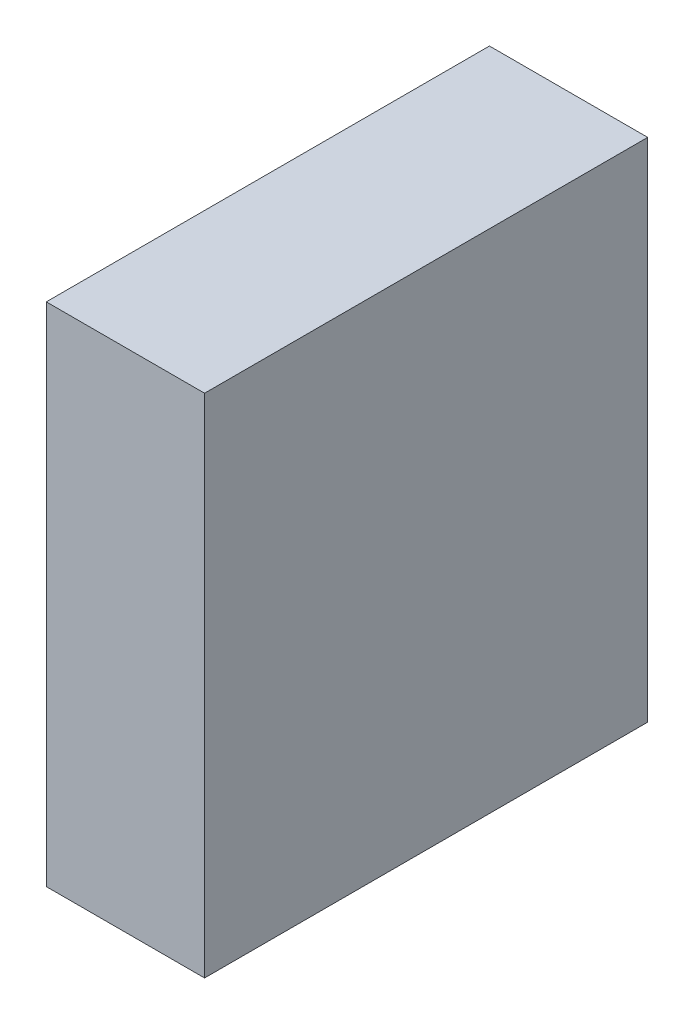
ISO-10303-21;
HEADER;
FILE_DESCRIPTION(('STEP AP214'),'2;1');
FILE_NAME('part.step','',(''),(''),'','','');
FILE_SCHEMA(('AUTOMOTIVE_DESIGN { 1 0 10303 214 1 1 1 1 }'));
ENDSEC;
DATA;
#1=APPLICATION_CONTEXT('core data for automotive mechanical design processes');
#2=APPLICATION_PROTOCOL_DEFINITION('international standard','automotive_design',2000,#1);
#3=PRODUCT_CONTEXT('',#1,'mechanical');
#4=PRODUCT('Part','Part','',(#3));
#5=PRODUCT_RELATED_PRODUCT_CATEGORY('part','',(#4));
#6=PRODUCT_DEFINITION_FORMATION('','',#4);
#7=PRODUCT_DEFINITION_CONTEXT('part definition',#1,'design');
#8=PRODUCT_DEFINITION('design','',#6,#7);
#9=PRODUCT_DEFINITION_SHAPE('','',#8);
#10=(LENGTH_UNIT() NAMED_UNIT(*) SI_UNIT(.MILLI.,.METRE.));
#11=(NAMED_UNIT(*) PLANE_ANGLE_UNIT() SI_UNIT($,.RADIAN.));
#12=(NAMED_UNIT(*) SI_UNIT($,.STERADIAN.) SOLID_ANGLE_UNIT());
#13=UNCERTAINTY_MEASURE_WITH_UNIT(LENGTH_MEASURE(1.E-05),#10,'distance_accuracy_value','');
#14=(GEOMETRIC_REPRESENTATION_CONTEXT(3) GLOBAL_UNCERTAINTY_ASSIGNED_CONTEXT((#13)) GLOBAL_UNIT_ASSIGNED_CONTEXT((#10,
#11,#12)) REPRESENTATION_CONTEXT('',''));
#15=CARTESIAN_POINT('',(0.,0.,0.));
#16=DIRECTION('',(0.,0.,1.));
#17=DIRECTION('',(1.,0.,0.));
#18=AXIS2_PLACEMENT_3D('',#15,#16,#17);
#19=CARTESIAN_POINT('',(-1.1,-0.8,0.));
#20=DIRECTION('',(1.,0.,0.));
#21=DIRECTION('',(0.,0.,-1.));
#22=AXIS2_PLACEMENT_3D('',#19,#20,#21);
#23=PLANE('',#22);
#24=DIRECTION('',(0.,0.,1.));
#25=VECTOR('',#24,1.);
#26=CARTESIAN_POINT('',(-1.1,0.8,0.));
#27=LINE('',#26,#25);
#28=CARTESIAN_POINT('',(-1.1,0.8,1.4));
#29=VERTEX_POINT('',#28);
#30=CARTESIAN_POINT('',(-1.1,0.8,0.));
#31=VERTEX_POINT('',#30);
#32=EDGE_CURVE('E76',#29,#31,#27,.F.);
#33=ORIENTED_EDGE('',*,*,#32,.F.);
#34=DIRECTION('',(0.,1.,0.));
#35=VECTOR('',#34,1.);
#36=CARTESIAN_POINT('',(-1.1,-0.8,1.4));
#37=LINE('',#36,#35);
#38=CARTESIAN_POINT('',(-1.1,-0.8,1.4));
#39=VERTEX_POINT('',#38);
#40=EDGE_CURVE('E58',#39,#29,#37,.T.);
#41=ORIENTED_EDGE('',*,*,#40,.F.);
#42=DIRECTION('',(0.,0.,1.));
#43=VECTOR('',#42,1.);
#44=CARTESIAN_POINT('',(-1.1,-0.8,0.));
#45=LINE('',#44,#43);
#46=CARTESIAN_POINT('',(-1.1,-0.8,0.));
#47=VERTEX_POINT('',#46);
#48=EDGE_CURVE('E20',#39,#47,#45,.F.);
#49=ORIENTED_EDGE('',*,*,#48,.T.);
#50=DIRECTION('',(0.,1.,0.));
#51=VECTOR('',#50,1.);
#52=CARTESIAN_POINT('',(-1.1,-0.8,0.));
#53=LINE('',#52,#51);
#54=EDGE_CURVE('E55',#47,#31,#53,.T.);
#55=ORIENTED_EDGE('',*,*,#54,.T.);
#56=EDGE_LOOP('',(#33,#41,#49,#55));
#57=FACE_BOUND('',#56,.T.);
#58=ADVANCED_FACE('F17',(#57),#23,.T.);
#59=CARTESIAN_POINT('',(-1.6,-0.8,0.));
#60=DIRECTION('',(0.,1.,0.));
#61=DIRECTION('',(0.,0.,1.));
#62=AXIS2_PLACEMENT_3D('',#59,#60,#61);
#63=PLANE('',#62);
#64=DIRECTION('',(1.,0.,0.));
#65=VECTOR('',#64,1.);
#66=CARTESIAN_POINT('',(-1.6,-0.8,1.4));
#67=LINE('',#66,#65);
#68=CARTESIAN_POINT('',(-1.6,-0.8,1.4));
#69=VERTEX_POINT('',#68);
#70=EDGE_CURVE('E78',#69,#39,#67,.T.);
#71=ORIENTED_EDGE('',*,*,#70,.F.);
#72=DIRECTION('',(0.,0.,-1.));
#73=VECTOR('',#72,1.);
#74=CARTESIAN_POINT('',(-1.6,-0.8,0.));
#75=LINE('',#74,#73);
#76=CARTESIAN_POINT('',(-1.6,-0.8,0.));
#77=VERTEX_POINT('',#76);
#78=EDGE_CURVE('E73',#69,#77,#75,.T.);
#79=ORIENTED_EDGE('',*,*,#78,.T.);
#80=DIRECTION('',(1.,0.,0.));
#81=VECTOR('',#80,1.);
#82=CARTESIAN_POINT('',(-1.6,-0.8,0.));
#83=LINE('',#82,#81);
#84=EDGE_CURVE('E63',#77,#47,#83,.T.);
#85=ORIENTED_EDGE('',*,*,#84,.T.);
#86=ORIENTED_EDGE('',*,*,#48,.F.);
#87=EDGE_LOOP('',(#71,#79,#85,#86));
#88=FACE_BOUND('',#87,.T.);
#89=ADVANCED_FACE('F72',(#88),#63,.F.);
#90=CARTESIAN_POINT('',(-1.6,-0.8,0.));
#91=DIRECTION('',(0.,0.,1.));
#92=DIRECTION('',(1.,0.,0.));
#93=AXIS2_PLACEMENT_3D('',#90,#91,#92);
#94=PLANE('',#93);
#95=ORIENTED_EDGE('',*,*,#54,.F.);
#96=ORIENTED_EDGE('',*,*,#84,.F.);
#97=DIRECTION('',(0.,1.,0.));
#98=VECTOR('',#97,1.);
#99=CARTESIAN_POINT('',(-1.6,-0.8,0.));
#100=LINE('',#99,#98);
#101=CARTESIAN_POINT('',(-1.6,0.8,0.));
#102=VERTEX_POINT('',#101);
#103=EDGE_CURVE('E83',#77,#102,#100,.T.);
#104=ORIENTED_EDGE('',*,*,#103,.T.);
#105=DIRECTION('',(1.,0.,0.));
#106=VECTOR('',#105,1.);
#107=CARTESIAN_POINT('',(-1.6,0.8,0.));
#108=LINE('',#107,#106);
#109=EDGE_CURVE('E69',#31,#102,#108,.F.);
#110=ORIENTED_EDGE('',*,*,#109,.F.);
#111=EDGE_LOOP('',(#95,#96,#104,#110));
#112=FACE_BOUND('',#111,.T.);
#113=ADVANCED_FACE('F66',(#112),#94,.F.);
#114=CARTESIAN_POINT('',(-1.6,0.8,0.));
#115=DIRECTION('',(0.,1.,0.));
#116=DIRECTION('',(0.,0.,1.));
#117=AXIS2_PLACEMENT_3D('',#114,#115,#116);
#118=PLANE('',#117);
#119=DIRECTION('',(1.,0.,0.));
#120=VECTOR('',#119,1.);
#121=CARTESIAN_POINT('',(-1.6,0.8,1.4));
#122=LINE('',#121,#120);
#123=CARTESIAN_POINT('',(-1.6,0.8,1.4));
#124=VERTEX_POINT('',#123);
#125=EDGE_CURVE('E34',#29,#124,#122,.F.);
#126=ORIENTED_EDGE('',*,*,#125,.F.);
#127=ORIENTED_EDGE('',*,*,#32,.T.);
#128=ORIENTED_EDGE('',*,*,#109,.T.);
#129=DIRECTION('',(0.,0.,-1.));
#130=VECTOR('',#129,1.);
#131=CARTESIAN_POINT('',(-1.6,0.8,0.));
#132=LINE('',#131,#130);
#133=EDGE_CURVE('E26',#102,#124,#132,.F.);
#134=ORIENTED_EDGE('',*,*,#133,.T.);
#135=EDGE_LOOP('',(#126,#127,#128,#134));
#136=FACE_BOUND('',#135,.T.);
#137=ADVANCED_FACE('F88',(#136),#118,.T.);
#138=CARTESIAN_POINT('',(-1.6,-0.8,1.4));
#139=DIRECTION('',(0.,0.,1.));
#140=DIRECTION('',(1.,0.,0.));
#141=AXIS2_PLACEMENT_3D('',#138,#139,#140);
#142=PLANE('',#141);
#143=ORIENTED_EDGE('',*,*,#40,.T.);
#144=ORIENTED_EDGE('',*,*,#125,.T.);
#145=DIRECTION('',(0.,1.,0.));
#146=VECTOR('',#145,1.);
#147=CARTESIAN_POINT('',(-1.6,-0.8,1.4));
#148=LINE('',#147,#146);
#149=EDGE_CURVE('E11',#124,#69,#148,.F.);
#150=ORIENTED_EDGE('',*,*,#149,.T.);
#151=ORIENTED_EDGE('',*,*,#70,.T.);
#152=EDGE_LOOP('',(#143,#144,#150,#151));
#153=FACE_BOUND('',#152,.T.);
#154=ADVANCED_FACE('F91',(#153),#142,.T.);
#155=CARTESIAN_POINT('',(-1.6,-0.8,0.));
#156=DIRECTION('',(1.,0.,0.));
#157=DIRECTION('',(0.,0.,-1.));
#158=AXIS2_PLACEMENT_3D('',#155,#156,#157);
#159=PLANE('',#158);
#160=ORIENTED_EDGE('',*,*,#133,.F.);
#161=ORIENTED_EDGE('',*,*,#103,.F.);
#162=ORIENTED_EDGE('',*,*,#78,.F.);
#163=ORIENTED_EDGE('',*,*,#149,.F.);
#164=EDGE_LOOP('',(#160,#161,#162,#163));
#165=FACE_BOUND('',#164,.T.);
#166=ADVANCED_FACE('F90',(#165),#159,.F.);
#167=CLOSED_SHELL('',(#58,#89,#113,#137,#154,#166));
#168=MANIFOLD_SOLID_BREP('B1',#167);
#169=ADVANCED_BREP_SHAPE_REPRESENTATION('',(#18,#168),#14);
#170=SHAPE_DEFINITION_REPRESENTATION(#9,#169);
ENDSEC;
END-ISO-10303-21;
